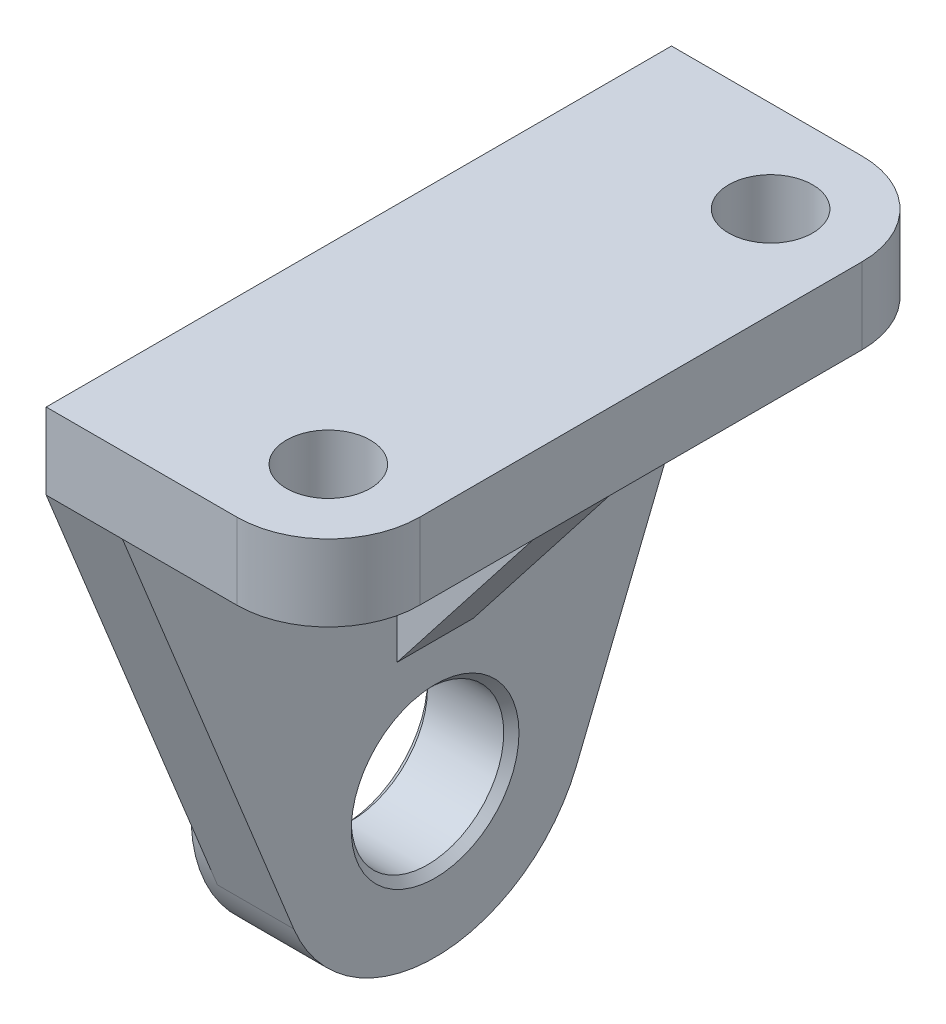
ISO-10303-21;
HEADER;
FILE_DESCRIPTION(('STEP AP214'),'2;1');
FILE_NAME('part.step','',(''),(''),'','','');
FILE_SCHEMA(('AUTOMOTIVE_DESIGN { 1 0 10303 214 1 1 1 1 }'));
ENDSEC;
DATA;
#1=APPLICATION_CONTEXT('core data for automotive mechanical design processes');
#2=APPLICATION_PROTOCOL_DEFINITION('international standard','automotive_design',2000,#1);
#3=PRODUCT_CONTEXT('',#1,'mechanical');
#4=PRODUCT('Part','Part','',(#3));
#5=PRODUCT_RELATED_PRODUCT_CATEGORY('part','',(#4));
#6=PRODUCT_DEFINITION_FORMATION('','',#4);
#7=PRODUCT_DEFINITION_CONTEXT('part definition',#1,'design');
#8=PRODUCT_DEFINITION('design','',#6,#7);
#9=PRODUCT_DEFINITION_SHAPE('','',#8);
#10=(LENGTH_UNIT() NAMED_UNIT(*) SI_UNIT(.MILLI.,.METRE.));
#11=(NAMED_UNIT(*) PLANE_ANGLE_UNIT() SI_UNIT($,.RADIAN.));
#12=(NAMED_UNIT(*) SI_UNIT($,.STERADIAN.) SOLID_ANGLE_UNIT());
#13=UNCERTAINTY_MEASURE_WITH_UNIT(LENGTH_MEASURE(1.E-05),#10,'distance_accuracy_value','');
#14=(GEOMETRIC_REPRESENTATION_CONTEXT(3) GLOBAL_UNCERTAINTY_ASSIGNED_CONTEXT((#13)) GLOBAL_UNIT_ASSIGNED_CONTEXT((#10,
#11,#12)) REPRESENTATION_CONTEXT('',''));
#15=CARTESIAN_POINT('',(0.,0.,0.));
#16=DIRECTION('',(0.,0.,1.));
#17=DIRECTION('',(1.,0.,0.));
#18=AXIS2_PLACEMENT_3D('',#15,#16,#17);
#19=CARTESIAN_POINT('',(-10.,58.,41.0000000000004));
#20=DIRECTION('',(0.,0.,1.00000000000001));
#21=DIRECTION('',(1.00000000000001,0.,0.));
#22=AXIS2_PLACEMENT_3D('',#19,#20,#21);
#23=PLANE('',#22);
#24=DIRECTION('',(-1.00000000000001,0.,0.));
#25=VECTOR('',#24,1.);
#26=CARTESIAN_POINT('',(27.0000000000004,48.,41.0000000000004));
#27=LINE('',#26,#25);
#28=CARTESIAN_POINT('',(15.0000000000004,48.,41.0000000000004));
#29=VERTEX_POINT('',#28);
#30=CARTESIAN_POINT('',(0.,48.,41.0000000000004));
#31=VERTEX_POINT('',#30);
#32=EDGE_CURVE('E178',#29,#31,#27,.T.);
#33=ORIENTED_EDGE('',*,*,#32,.F.);
#34=DIRECTION('',(0.,1.,0.));
#35=VECTOR('',#34,1.);
#36=CARTESIAN_POINT('',(15.0000000000004,58.,41.0000000000004));
#37=LINE('',#36,#35);
#38=CARTESIAN_POINT('',(15.0000000000004,58.,41.0000000000004));
#39=VERTEX_POINT('',#38);
#40=EDGE_CURVE('E244',#29,#39,#37,.T.);
#41=ORIENTED_EDGE('',*,*,#40,.T.);
#42=DIRECTION('',(1.00000000000001,0.,0.));
#43=VECTOR('',#42,1.);
#44=CARTESIAN_POINT('',(-10.,58.,41.0000000000004));
#45=LINE('',#44,#43);
#46=CARTESIAN_POINT('',(-10.,58.,41.0000000000004));
#47=VERTEX_POINT('',#46);
#48=EDGE_CURVE('E211',#47,#39,#45,.T.);
#49=ORIENTED_EDGE('',*,*,#48,.F.);
#50=DIRECTION('',(0.,-1.,0.));
#51=VECTOR('',#50,1.);
#52=CARTESIAN_POINT('',(-10.,58.,41.0000000000004));
#53=LINE('',#52,#51);
#54=CARTESIAN_POINT('',(-10.,48.,41.0000000000004));
#55=VERTEX_POINT('',#54);
#56=EDGE_CURVE('E188',#47,#55,#53,.T.);
#57=ORIENTED_EDGE('',*,*,#56,.T.);
#58=DIRECTION('',(1.00000000000001,0.,0.));
#59=VECTOR('',#58,1.);
#60=CARTESIAN_POINT('',(-10.,48.,41.0000000000004));
#61=LINE('',#60,#59);
#62=EDGE_CURVE('E203',#55,#31,#61,.T.);
#63=ORIENTED_EDGE('',*,*,#62,.T.);
#64=EDGE_LOOP('',(#33,#41,#49,#57,#63));
#65=FACE_BOUND('',#64,.T.);
#66=ADVANCED_FACE('F32',(#65),#23,.T.);
#67=CARTESIAN_POINT('',(-10.,58.,41.0000000000004));
#68=DIRECTION('',(0.,1.,0.));
#69=DIRECTION('',(0.,0.,1.00000000000001));
#70=AXIS2_PLACEMENT_3D('',#67,#68,#69);
#71=PLANE('',#70);
#72=DIRECTION('',(0.,0.,-1.00000000000001));
#73=VECTOR('',#72,1.);
#74=CARTESIAN_POINT('',(27.0000000000004,58.,-41.0000000000004));
#75=LINE('',#74,#73);
#76=CARTESIAN_POINT('',(27.0000000000004,58.,29.0000000000004));
#77=VERTEX_POINT('',#76);
#78=CARTESIAN_POINT('',(27.0000000000004,58.,-29.0000000000004));
#79=VERTEX_POINT('',#78);
#80=EDGE_CURVE('E175',#77,#79,#75,.T.);
#81=ORIENTED_EDGE('',*,*,#80,.T.);
#82=CARTESIAN_POINT('',(15.0000000000004,58.,-29.0000000000004));
#83=DIRECTION('',(0.,1.,0.));
#84=DIRECTION('',(0.,0.,1.00000000000001));
#85=AXIS2_PLACEMENT_3D('',#82,#83,#84);
#86=CIRCLE('',#85,12.);
#87=CARTESIAN_POINT('',(15.0000000000004,58.,-41.0000000000004));
#88=VERTEX_POINT('',#87);
#89=EDGE_CURVE('E242',#79,#88,#86,.T.);
#90=ORIENTED_EDGE('',*,*,#89,.T.);
#91=DIRECTION('',(1.00000000000001,0.,0.));
#92=VECTOR('',#91,1.);
#93=CARTESIAN_POINT('',(-10.,58.,-41.0000000000004));
#94=LINE('',#93,#92);
#95=CARTESIAN_POINT('',(-10.,58.,-41.0000000000004));
#96=VERTEX_POINT('',#95);
#97=EDGE_CURVE('E215',#96,#88,#94,.T.);
#98=ORIENTED_EDGE('',*,*,#97,.F.);
#99=DIRECTION('',(0.,0.,1.00000000000001));
#100=VECTOR('',#99,1.);
#101=CARTESIAN_POINT('',(-10.,58.,41.0000000000004));
#102=LINE('',#101,#100);
#103=EDGE_CURVE('E201',#96,#47,#102,.T.);
#104=ORIENTED_EDGE('',*,*,#103,.T.);
#105=ORIENTED_EDGE('',*,*,#48,.T.);
#106=CARTESIAN_POINT('',(15.0000000000004,58.,29.0000000000004));
#107=DIRECTION('',(0.,1.,0.));
#108=DIRECTION('',(0.,0.,1.00000000000001));
#109=AXIS2_PLACEMENT_3D('',#106,#107,#108);
#110=CIRCLE('',#109,12.);
#111=EDGE_CURVE('E55',#39,#77,#110,.T.);
#112=ORIENTED_EDGE('',*,*,#111,.T.);
#113=EDGE_LOOP('',(#81,#90,#98,#104,#105,#112));
#114=FACE_BOUND('',#113,.T.);
#115=CARTESIAN_POINT('',(15.0000000000004,58.,29.0000000000004));
#116=DIRECTION('',(0.,-1.,0.));
#117=DIRECTION('',(0.,0.,-1.00000000000001));
#118=AXIS2_PLACEMENT_3D('',#115,#116,#117);
#119=CIRCLE('',#118,5.5);
#120=CARTESIAN_POINT('',(15.0000000000004,58.,23.5000000000003));
#121=VERTEX_POINT('',#120);
#122=EDGE_CURVE('E144',#121,#121,#119,.T.);
#123=ORIENTED_EDGE('',*,*,#122,.T.);
#124=EDGE_LOOP('',(#123));
#125=FACE_BOUND('',#124,.T.);
#126=CARTESIAN_POINT('',(15.0000000000004,58.,-29.0000000000004));
#127=DIRECTION('',(0.,-1.,0.));
#128=DIRECTION('',(0.,0.,-1.00000000000001));
#129=AXIS2_PLACEMENT_3D('',#126,#127,#128);
#130=CIRCLE('',#129,5.5);
#131=CARTESIAN_POINT('',(15.0000000000004,58.,-34.5000000000005));
#132=VERTEX_POINT('',#131);
#133=EDGE_CURVE('E160',#132,#132,#130,.T.);
#134=ORIENTED_EDGE('',*,*,#133,.T.);
#135=EDGE_LOOP('',(#134));
#136=FACE_BOUND('',#135,.T.);
#137=ADVANCED_FACE('F275',(#114,#125,#136),#71,.T.);
#138=CARTESIAN_POINT('',(-10.,58.,-41.0000000000004));
#139=DIRECTION('',(0.,0.,-1.00000000000001));
#140=DIRECTION('',(-1.00000000000001,0.,0.));
#141=AXIS2_PLACEMENT_3D('',#138,#139,#140);
#142=PLANE('',#141);
#143=ORIENTED_EDGE('',*,*,#97,.T.);
#144=DIRECTION('',(0.,-1.,0.));
#145=VECTOR('',#144,1.);
#146=CARTESIAN_POINT('',(15.0000000000004,48.,-41.0000000000004));
#147=LINE('',#146,#145);
#148=CARTESIAN_POINT('',(15.0000000000004,48.,-41.0000000000004));
#149=VERTEX_POINT('',#148);
#150=EDGE_CURVE('E229',#88,#149,#147,.T.);
#151=ORIENTED_EDGE('',*,*,#150,.T.);
#152=DIRECTION('',(-1.00000000000001,0.,0.));
#153=VECTOR('',#152,1.);
#154=CARTESIAN_POINT('',(27.0000000000004,48.,-41.0000000000004));
#155=LINE('',#154,#153);
#156=CARTESIAN_POINT('',(0.,48.,-41.0000000000004));
#157=VERTEX_POINT('',#156);
#158=EDGE_CURVE('E177',#149,#157,#155,.T.);
#159=ORIENTED_EDGE('',*,*,#158,.T.);
#160=DIRECTION('',(1.00000000000001,0.,0.));
#161=VECTOR('',#160,1.);
#162=CARTESIAN_POINT('',(-10.,48.,-41.0000000000004));
#163=LINE('',#162,#161);
#164=CARTESIAN_POINT('',(-10.,48.,-41.0000000000004));
#165=VERTEX_POINT('',#164);
#166=EDGE_CURVE('E218',#165,#157,#163,.T.);
#167=ORIENTED_EDGE('',*,*,#166,.F.);
#168=DIRECTION('',(0.,1.,0.));
#169=VECTOR('',#168,1.);
#170=CARTESIAN_POINT('',(-10.,58.,-41.0000000000004));
#171=LINE('',#170,#169);
#172=EDGE_CURVE('E198',#165,#96,#171,.T.);
#173=ORIENTED_EDGE('',*,*,#172,.T.);
#174=EDGE_LOOP('',(#143,#151,#159,#167,#173));
#175=FACE_BOUND('',#174,.T.);
#176=ADVANCED_FACE('F281',(#175),#142,.T.);
#177=CARTESIAN_POINT('',(-10.,48.,-41.0000000000004));
#178=DIRECTION('',(0.,-0.375124128057045,-0.926974588944846));
#179=DIRECTION('',(0.,0.926974588944833,-0.375124128057052));
#180=AXIS2_PLACEMENT_3D('',#177,#178,#179);
#181=PLANE('',#180);
#182=DIRECTION('',(0.,0.926974588944833,-0.375124128057052));
#183=VECTOR('',#182,1.);
#184=CARTESIAN_POINT('',(0.,48.,-41.0000000000004));
#185=LINE('',#184,#183);
#186=CARTESIAN_POINT('',(0.,-7.50248256114089,-18.5394917788969));
#187=VERTEX_POINT('',#186);
#188=EDGE_CURVE('E192',#187,#157,#185,.T.);
#189=ORIENTED_EDGE('',*,*,#188,.F.);
#190=DIRECTION('',(1.00000000000001,0.,0.));
#191=VECTOR('',#190,1.);
#192=CARTESIAN_POINT('',(-10.,-7.50248256114089,-18.5394917788969));
#193=LINE('',#192,#191);
#194=CARTESIAN_POINT('',(-10.,-7.5024825611409,-18.5394917788969));
#195=VERTEX_POINT('',#194);
#196=EDGE_CURVE('E221',#195,#187,#193,.T.);
#197=ORIENTED_EDGE('',*,*,#196,.F.);
#198=DIRECTION('',(0.,0.926974588944833,-0.375124128057052));
#199=VECTOR('',#198,1.);
#200=CARTESIAN_POINT('',(-10.,48.,-41.0000000000004));
#201=LINE('',#200,#199);
#202=EDGE_CURVE('E195',#195,#165,#201,.T.);
#203=ORIENTED_EDGE('',*,*,#202,.T.);
#204=ORIENTED_EDGE('',*,*,#166,.T.);
#205=EDGE_LOOP('',(#189,#197,#203,#204));
#206=FACE_BOUND('',#205,.T.);
#207=ADVANCED_FACE('F339',(#206),#181,.T.);
#208=CARTESIAN_POINT('',(-10.,0.,0.));
#209=DIRECTION('',(1.00000000000001,0.,0.));
#210=DIRECTION('',(0.,0.,-1.00000000000001));
#211=AXIS2_PLACEMENT_3D('',#208,#209,#210);
#212=CYLINDRICAL_SURFACE('',#211,20.);
#213=DIRECTION('',(1.00000000000001,0.,0.));
#214=VECTOR('',#213,1.);
#215=CARTESIAN_POINT('',(-10.,-7.50248256114089,18.5394917788969));
#216=LINE('',#215,#214);
#217=CARTESIAN_POINT('',(-10.,-7.50248256114089,18.5394917788969));
#218=VERTEX_POINT('',#217);
#219=CARTESIAN_POINT('',(0.,-7.50248256114089,18.5394917788969));
#220=VERTEX_POINT('',#219);
#221=EDGE_CURVE('E223',#218,#220,#216,.T.);
#222=ORIENTED_EDGE('',*,*,#221,.F.);
#223=CARTESIAN_POINT('',(-10.,0.,0.));
#224=DIRECTION('',(1.00000000000001,0.,0.));
#225=DIRECTION('',(0.,0.,-1.00000000000001));
#226=AXIS2_PLACEMENT_3D('',#223,#224,#225);
#227=CIRCLE('',#226,20.);
#228=EDGE_CURVE('E185',#195,#218,#227,.T.);
#229=ORIENTED_EDGE('',*,*,#228,.F.);
#230=ORIENTED_EDGE('',*,*,#196,.T.);
#231=CARTESIAN_POINT('',(0.,0.,0.));
#232=DIRECTION('',(1.00000000000001,0.,0.));
#233=DIRECTION('',(0.,0.,-1.00000000000001));
#234=AXIS2_PLACEMENT_3D('',#231,#232,#233);
#235=CIRCLE('',#234,20.);
#236=EDGE_CURVE('E206',#220,#187,#235,.T.);
#237=ORIENTED_EDGE('',*,*,#236,.F.);
#238=EDGE_LOOP('',(#222,#229,#230,#237));
#239=FACE_BOUND('',#238,.T.);
#240=CARTESIAN_POINT('',(-12.0000000000001,0.,0.));
#241=DIRECTION('',(1.00000000000001,0.,0.));
#242=DIRECTION('',(0.,0.,-1.00000000000001));
#243=AXIS2_PLACEMENT_3D('',#240,#241,#242);
#244=CIRCLE('',#243,20.);
#245=CARTESIAN_POINT('',(-12.0000000000001,0.,-20.0000000000003));
#246=VERTEX_POINT('',#245);
#247=EDGE_CURVE('E180',#246,#246,#244,.T.);
#248=ORIENTED_EDGE('',*,*,#247,.T.);
#249=EDGE_LOOP('',(#248));
#250=FACE_BOUND('',#249,.T.);
#251=ADVANCED_FACE('F336',(#239,#250),#212,.T.);
#252=CARTESIAN_POINT('',(-10.,48.,41.0000000000004));
#253=DIRECTION('',(0.,-0.375124128057045,0.926974588944846));
#254=DIRECTION('',(0.,-0.926974588944833,-0.375124128057052));
#255=AXIS2_PLACEMENT_3D('',#252,#253,#254);
#256=PLANE('',#255);
#257=DIRECTION('',(0.,-0.926974588944833,-0.375124128057052));
#258=VECTOR('',#257,1.);
#259=CARTESIAN_POINT('',(0.,48.,41.0000000000004));
#260=LINE('',#259,#258);
#261=EDGE_CURVE('E187',#31,#220,#260,.T.);
#262=ORIENTED_EDGE('',*,*,#261,.F.);
#263=ORIENTED_EDGE('',*,*,#62,.F.);
#264=DIRECTION('',(0.,-0.926974588944833,-0.375124128057052));
#265=VECTOR('',#264,1.);
#266=CARTESIAN_POINT('',(-10.,48.,41.0000000000004));
#267=LINE('',#266,#265);
#268=EDGE_CURVE('E191',#55,#218,#267,.T.);
#269=ORIENTED_EDGE('',*,*,#268,.T.);
#270=ORIENTED_EDGE('',*,*,#221,.T.);
#271=EDGE_LOOP('',(#262,#263,#269,#270));
#272=FACE_BOUND('',#271,.T.);
#273=ADVANCED_FACE('F287',(#272),#256,.T.);
#274=CARTESIAN_POINT('',(-10.,0.,0.));
#275=DIRECTION('',(1.00000000000001,0.,0.));
#276=DIRECTION('',(0.,0.,-1.00000000000001));
#277=AXIS2_PLACEMENT_3D('',#274,#275,#276);
#278=PLANE('',#277);
#279=ORIENTED_EDGE('',*,*,#56,.F.);
#280=ORIENTED_EDGE('',*,*,#103,.F.);
#281=ORIENTED_EDGE('',*,*,#172,.F.);
#282=ORIENTED_EDGE('',*,*,#202,.F.);
#283=ORIENTED_EDGE('',*,*,#228,.T.);
#284=ORIENTED_EDGE('',*,*,#268,.F.);
#285=EDGE_LOOP('',(#279,#280,#281,#282,#283,#284));
#286=FACE_BOUND('',#285,.T.);
#287=ADVANCED_FACE('F332',(#286),#278,.F.);
#288=CARTESIAN_POINT('',(0.,0.,0.));
#289=DIRECTION('',(1.00000000000001,0.,0.));
#290=DIRECTION('',(0.,0.,-1.00000000000001));
#291=AXIS2_PLACEMENT_3D('',#288,#289,#290);
#292=PLANE('',#291);
#293=CARTESIAN_POINT('',(0.,0.,0.));
#294=DIRECTION('',(1.00000000000001,0.,0.));
#295=DIRECTION('',(0.,0.,-1.00000000000001));
#296=AXIS2_PLACEMENT_3D('',#293,#294,#295);
#297=CIRCLE('',#296,11.);
#298=CARTESIAN_POINT('',(0.,0.,-11.0000000000002));
#299=VERTEX_POINT('',#298);
#300=EDGE_CURVE('E11',#299,#299,#297,.F.);
#301=ORIENTED_EDGE('',*,*,#300,.T.);
#302=EDGE_LOOP('',(#301));
#303=FACE_BOUND('',#302,.T.);
#304=DIRECTION('',(0.,-1.,0.));
#305=VECTOR('',#304,1.);
#306=CARTESIAN_POINT('',(0.,0.,5.00000000000005));
#307=LINE('',#306,#305);
#308=CARTESIAN_POINT('',(0.,48.,5.00000000000005));
#309=VERTEX_POINT('',#308);
#310=CARTESIAN_POINT('',(0.,16.,5.00000000000005));
#311=VERTEX_POINT('',#310);
#312=EDGE_CURVE('E142',#309,#311,#307,.T.);
#313=ORIENTED_EDGE('',*,*,#312,.F.);
#314=DIRECTION('',(0.,0.,-1.00000000000001));
#315=VECTOR('',#314,1.);
#316=CARTESIAN_POINT('',(0.,48.,0.));
#317=LINE('',#316,#315);
#318=EDGE_CURVE('E227',#31,#309,#317,.T.);
#319=ORIENTED_EDGE('',*,*,#318,.F.);
#320=ORIENTED_EDGE('',*,*,#261,.T.);
#321=ORIENTED_EDGE('',*,*,#236,.T.);
#322=ORIENTED_EDGE('',*,*,#188,.T.);
#323=CARTESIAN_POINT('',(0.,48.,-5.00000000000005));
#324=VERTEX_POINT('',#323);
#325=EDGE_CURVE('E214',#324,#157,#317,.T.);
#326=ORIENTED_EDGE('',*,*,#325,.F.);
#327=DIRECTION('',(0.,-1.,0.));
#328=VECTOR('',#327,1.);
#329=CARTESIAN_POINT('',(0.,0.,-5.00000000000005));
#330=LINE('',#329,#328);
#331=CARTESIAN_POINT('',(0.,16.,-5.00000000000005));
#332=VERTEX_POINT('',#331);
#333=EDGE_CURVE('E47',#324,#332,#330,.T.);
#334=ORIENTED_EDGE('',*,*,#333,.T.);
#335=DIRECTION('',(0.,0.,1.00000000000001));
#336=VECTOR('',#335,1.);
#337=CARTESIAN_POINT('',(0.,16.,0.));
#338=LINE('',#337,#336);
#339=EDGE_CURVE('E135',#311,#332,#338,.F.);
#340=ORIENTED_EDGE('',*,*,#339,.F.);
#341=EDGE_LOOP('',(#313,#319,#320,#321,#322,#326,#334,#340));
#342=FACE_BOUND('',#341,.T.);
#343=ADVANCED_FACE('F315',(#303,#342),#292,.T.);
#344=CARTESIAN_POINT('',(-12.0000000000001,0.,0.));
#345=DIRECTION('',(1.00000000000001,0.,0.));
#346=DIRECTION('',(0.,0.,-1.00000000000001));
#347=AXIS2_PLACEMENT_3D('',#344,#345,#346);
#348=PLANE('',#347);
#349=CARTESIAN_POINT('',(-12.0000000000001,0.,0.));
#350=DIRECTION('',(1.00000000000001,0.,0.));
#351=DIRECTION('',(0.,0.,-1.00000000000001));
#352=AXIS2_PLACEMENT_3D('',#349,#350,#351);
#353=CIRCLE('',#352,11.);
#354=CARTESIAN_POINT('',(-12.0000000000001,0.,-11.0000000000001));
#355=VERTEX_POINT('',#354);
#356=EDGE_CURVE('E40',#355,#355,#353,.T.);
#357=ORIENTED_EDGE('',*,*,#356,.T.);
#358=EDGE_LOOP('',(#357));
#359=FACE_BOUND('',#358,.T.);
#360=ORIENTED_EDGE('',*,*,#247,.F.);
#361=EDGE_LOOP('',(#360));
#362=FACE_BOUND('',#361,.T.);
#363=ADVANCED_FACE('F254',(#359,#362),#348,.F.);
#364=CARTESIAN_POINT('',(27.0000000000004,48.,-41.0000000000004));
#365=DIRECTION('',(0.,-1.,0.));
#366=DIRECTION('',(0.,0.,-1.00000000000001));
#367=AXIS2_PLACEMENT_3D('',#364,#365,#366);
#368=PLANE('',#367);
#369=DIRECTION('',(-1.00000000000001,0.,0.));
#370=VECTOR('',#369,1.);
#371=CARTESIAN_POINT('',(27.0000000000004,48.,5.00000000000005));
#372=LINE('',#371,#370);
#373=CARTESIAN_POINT('',(25.0000000000004,48.,5.00000000000005));
#374=VERTEX_POINT('',#373);
#375=EDGE_CURVE('E141',#374,#309,#372,.T.);
#376=ORIENTED_EDGE('',*,*,#375,.F.);
#377=DIRECTION('',(0.,0.,-1.00000000000001));
#378=VECTOR('',#377,1.);
#379=CARTESIAN_POINT('',(25.0000000000004,48.,-41.0000000000004));
#380=LINE('',#379,#378);
#381=CARTESIAN_POINT('',(25.0000000000004,48.,-5.00000000000005));
#382=VERTEX_POINT('',#381);
#383=EDGE_CURVE('E132',#382,#374,#380,.F.);
#384=ORIENTED_EDGE('',*,*,#383,.F.);
#385=DIRECTION('',(-1.00000000000001,0.,0.));
#386=VECTOR('',#385,1.);
#387=CARTESIAN_POINT('',(27.0000000000004,48.,-5.00000000000005));
#388=LINE('',#387,#386);
#389=EDGE_CURVE('E120',#382,#324,#388,.T.);
#390=ORIENTED_EDGE('',*,*,#389,.T.);
#391=ORIENTED_EDGE('',*,*,#325,.T.);
#392=ORIENTED_EDGE('',*,*,#158,.F.);
#393=CARTESIAN_POINT('',(15.0000000000004,48.,-29.0000000000004));
#394=DIRECTION('',(0.,-1.,0.));
#395=DIRECTION('',(0.,0.,-1.00000000000001));
#396=AXIS2_PLACEMENT_3D('',#393,#394,#395);
#397=CIRCLE('',#396,12.);
#398=CARTESIAN_POINT('',(27.0000000000004,48.,-29.0000000000004));
#399=VERTEX_POINT('',#398);
#400=EDGE_CURVE('E234',#149,#399,#397,.T.);
#401=ORIENTED_EDGE('',*,*,#400,.T.);
#402=DIRECTION('',(0.,0.,1.00000000000001));
#403=VECTOR('',#402,1.);
#404=CARTESIAN_POINT('',(27.0000000000004,48.,-41.0000000000004));
#405=LINE('',#404,#403);
#406=CARTESIAN_POINT('',(27.0000000000004,48.,29.0000000000004));
#407=VERTEX_POINT('',#406);
#408=EDGE_CURVE('E172',#399,#407,#405,.T.);
#409=ORIENTED_EDGE('',*,*,#408,.T.);
#410=CARTESIAN_POINT('',(15.0000000000004,48.,29.0000000000004));
#411=DIRECTION('',(0.,-1.,0.));
#412=DIRECTION('',(0.,0.,-1.00000000000001));
#413=AXIS2_PLACEMENT_3D('',#410,#411,#412);
#414=CIRCLE('',#413,12.);
#415=EDGE_CURVE('E232',#407,#29,#414,.T.);
#416=ORIENTED_EDGE('',*,*,#415,.T.);
#417=ORIENTED_EDGE('',*,*,#32,.T.);
#418=ORIENTED_EDGE('',*,*,#318,.T.);
#419=EDGE_LOOP('',(#376,#384,#390,#391,#392,#401,#409,#416,#417,#418));
#420=FACE_BOUND('',#419,.T.);
#421=CARTESIAN_POINT('',(15.0000000000004,48.,29.0000000000004));
#422=DIRECTION('',(0.,-1.,0.));
#423=DIRECTION('',(0.,0.,-1.00000000000001));
#424=AXIS2_PLACEMENT_3D('',#421,#422,#423);
#425=CIRCLE('',#424,11.);
#426=CARTESIAN_POINT('',(15.0000000000004,48.,18.0000000000003));
#427=VERTEX_POINT('',#426);
#428=EDGE_CURVE('E157',#427,#427,#425,.T.);
#429=ORIENTED_EDGE('',*,*,#428,.F.);
#430=EDGE_LOOP('',(#429));
#431=FACE_BOUND('',#430,.T.);
#432=CARTESIAN_POINT('',(15.0000000000004,48.,-29.0000000000004));
#433=DIRECTION('',(0.,-1.,0.));
#434=DIRECTION('',(0.,0.,-1.00000000000001));
#435=AXIS2_PLACEMENT_3D('',#432,#433,#434);
#436=CIRCLE('',#435,11.);
#437=CARTESIAN_POINT('',(15.0000000000004,48.,-40.0000000000006));
#438=VERTEX_POINT('',#437);
#439=EDGE_CURVE('E169',#438,#438,#436,.T.);
#440=ORIENTED_EDGE('',*,*,#439,.F.);
#441=EDGE_LOOP('',(#440));
#442=FACE_BOUND('',#441,.T.);
#443=ADVANCED_FACE('F138',(#420,#431,#442),#368,.T.);
#444=CARTESIAN_POINT('',(27.0000000000004,48.,-41.0000000000004));
#445=DIRECTION('',(-1.00000000000001,0.,0.));
#446=DIRECTION('',(0.,0.,1.00000000000001));
#447=AXIS2_PLACEMENT_3D('',#444,#445,#446);
#448=PLANE('',#447);
#449=DIRECTION('',(0.,-1.,0.));
#450=VECTOR('',#449,1.);
#451=CARTESIAN_POINT('',(27.0000000000004,58.,-29.0000000000004));
#452=LINE('',#451,#450);
#453=EDGE_CURVE('E238',#399,#79,#452,.F.);
#454=ORIENTED_EDGE('',*,*,#453,.T.);
#455=ORIENTED_EDGE('',*,*,#80,.F.);
#456=DIRECTION('',(0.,1.,0.));
#457=VECTOR('',#456,1.);
#458=CARTESIAN_POINT('',(27.0000000000004,48.,29.0000000000004));
#459=LINE('',#458,#457);
#460=EDGE_CURVE('E236',#77,#407,#459,.F.);
#461=ORIENTED_EDGE('',*,*,#460,.T.);
#462=ORIENTED_EDGE('',*,*,#408,.F.);
#463=EDGE_LOOP('',(#454,#455,#461,#462));
#464=FACE_BOUND('',#463,.T.);
#465=ADVANCED_FACE('F293',(#464),#448,.F.);
#466=CARTESIAN_POINT('',(15.0000000000004,58.,-29.0000000000004));
#467=DIRECTION('',(0.,1.,0.));
#468=DIRECTION('',(0.,0.,1.00000000000001));
#469=AXIS2_PLACEMENT_3D('',#466,#467,#468);
#470=CYLINDRICAL_SURFACE('',#469,12.);
#471=ORIENTED_EDGE('',*,*,#89,.F.);
#472=ORIENTED_EDGE('',*,*,#453,.F.);
#473=ORIENTED_EDGE('',*,*,#400,.F.);
#474=ORIENTED_EDGE('',*,*,#150,.F.);
#475=EDGE_LOOP('',(#471,#472,#473,#474));
#476=FACE_BOUND('',#475,.T.);
#477=ADVANCED_FACE('F289',(#476),#470,.T.);
#478=CARTESIAN_POINT('',(15.0000000000004,58.,29.0000000000004));
#479=DIRECTION('',(0.,-1.,0.));
#480=DIRECTION('',(0.,0.,-1.00000000000001));
#481=AXIS2_PLACEMENT_3D('',#478,#479,#480);
#482=CYLINDRICAL_SURFACE('',#481,12.);
#483=ORIENTED_EDGE('',*,*,#415,.F.);
#484=ORIENTED_EDGE('',*,*,#460,.F.);
#485=ORIENTED_EDGE('',*,*,#111,.F.);
#486=ORIENTED_EDGE('',*,*,#40,.F.);
#487=EDGE_LOOP('',(#483,#484,#485,#486));
#488=FACE_BOUND('',#487,.T.);
#489=ADVANCED_FACE('F292',(#488),#482,.T.);
#490=CARTESIAN_POINT('',(15.0000000000004,48.,-29.0000000000004));
#491=DIRECTION('',(0.,-1.,0.));
#492=DIRECTION('',(0.,0.,-1.00000000000001));
#493=AXIS2_PLACEMENT_3D('',#490,#491,#492);
#494=CYLINDRICAL_SURFACE('',#493,11.);
#495=CARTESIAN_POINT('',(15.0000000000004,49.,-29.0000000000004));
#496=DIRECTION('',(0.,-1.,0.));
#497=DIRECTION('',(0.,0.,-1.00000000000001));
#498=AXIS2_PLACEMENT_3D('',#495,#496,#497);
#499=CIRCLE('',#498,11.);
#500=CARTESIAN_POINT('',(15.0000000000004,49.,-40.0000000000006));
#501=VERTEX_POINT('',#500);
#502=EDGE_CURVE('E166',#501,#501,#499,.T.);
#503=ORIENTED_EDGE('',*,*,#502,.F.);
#504=EDGE_LOOP('',(#503));
#505=FACE_BOUND('',#504,.T.);
#506=ORIENTED_EDGE('',*,*,#439,.T.);
#507=EDGE_LOOP('',(#506));
#508=FACE_BOUND('',#507,.T.);
#509=ADVANCED_FACE('F296',(#505,#508),#494,.F.);
#510=CARTESIAN_POINT('',(20.5000000000004,49.,-29.0000000000004));
#511=DIRECTION('',(0.,1.,0.));
#512=DIRECTION('',(0.,0.,1.00000000000001));
#513=AXIS2_PLACEMENT_3D('',#510,#511,#512);
#514=PLANE('',#513);
#515=CARTESIAN_POINT('',(15.0000000000004,49.,-29.0000000000004));
#516=DIRECTION('',(0.,-1.,0.));
#517=DIRECTION('',(0.,0.,-1.00000000000001));
#518=AXIS2_PLACEMENT_3D('',#515,#516,#517);
#519=CIRCLE('',#518,5.5);
#520=CARTESIAN_POINT('',(15.0000000000004,49.,-34.5000000000005));
#521=VERTEX_POINT('',#520);
#522=EDGE_CURVE('E163',#521,#521,#519,.T.);
#523=ORIENTED_EDGE('',*,*,#522,.F.);
#524=EDGE_LOOP('',(#523));
#525=FACE_BOUND('',#524,.T.);
#526=ORIENTED_EDGE('',*,*,#502,.T.);
#527=EDGE_LOOP('',(#526));
#528=FACE_BOUND('',#527,.T.);
#529=ADVANCED_FACE('F300',(#525,#528),#514,.F.);
#530=CARTESIAN_POINT('',(15.0000000000004,48.,-29.0000000000004));
#531=DIRECTION('',(0.,-1.,0.));
#532=DIRECTION('',(0.,0.,-1.00000000000001));
#533=AXIS2_PLACEMENT_3D('',#530,#531,#532);
#534=CYLINDRICAL_SURFACE('',#533,5.5);
#535=ORIENTED_EDGE('',*,*,#133,.F.);
#536=EDGE_LOOP('',(#535));
#537=FACE_BOUND('',#536,.T.);
#538=ORIENTED_EDGE('',*,*,#522,.T.);
#539=EDGE_LOOP('',(#538));
#540=FACE_BOUND('',#539,.T.);
#541=ADVANCED_FACE('F361',(#537,#540),#534,.F.);
#542=CARTESIAN_POINT('',(15.0000000000004,48.,29.0000000000004));
#543=DIRECTION('',(0.,-1.,0.));
#544=DIRECTION('',(0.,0.,-1.00000000000001));
#545=AXIS2_PLACEMENT_3D('',#542,#543,#544);
#546=CYLINDRICAL_SURFACE('',#545,11.);
#547=CARTESIAN_POINT('',(15.0000000000004,49.,29.0000000000004));
#548=DIRECTION('',(0.,-1.,0.));
#549=DIRECTION('',(0.,0.,-1.00000000000001));
#550=AXIS2_PLACEMENT_3D('',#547,#548,#549);
#551=CIRCLE('',#550,11.);
#552=CARTESIAN_POINT('',(15.0000000000004,49.,18.0000000000003));
#553=VERTEX_POINT('',#552);
#554=EDGE_CURVE('E154',#553,#553,#551,.T.);
#555=ORIENTED_EDGE('',*,*,#554,.F.);
#556=EDGE_LOOP('',(#555));
#557=FACE_BOUND('',#556,.T.);
#558=ORIENTED_EDGE('',*,*,#428,.T.);
#559=EDGE_LOOP('',(#558));
#560=FACE_BOUND('',#559,.T.);
#561=ADVANCED_FACE('F365',(#557,#560),#546,.F.);
#562=CARTESIAN_POINT('',(20.5000000000004,49.,29.0000000000004));
#563=DIRECTION('',(0.,1.,0.));
#564=DIRECTION('',(0.,0.,1.00000000000001));
#565=AXIS2_PLACEMENT_3D('',#562,#563,#564);
#566=PLANE('',#565);
#567=CARTESIAN_POINT('',(15.0000000000004,49.,29.0000000000004));
#568=DIRECTION('',(0.,-1.,0.));
#569=DIRECTION('',(0.,0.,-1.00000000000001));
#570=AXIS2_PLACEMENT_3D('',#567,#568,#569);
#571=CIRCLE('',#570,5.5);
#572=CARTESIAN_POINT('',(15.0000000000004,49.,23.5000000000003));
#573=VERTEX_POINT('',#572);
#574=EDGE_CURVE('E151',#573,#573,#571,.T.);
#575=ORIENTED_EDGE('',*,*,#574,.F.);
#576=EDGE_LOOP('',(#575));
#577=FACE_BOUND('',#576,.T.);
#578=ORIENTED_EDGE('',*,*,#554,.T.);
#579=EDGE_LOOP('',(#578));
#580=FACE_BOUND('',#579,.T.);
#581=ADVANCED_FACE('F369',(#577,#580),#566,.F.);
#582=CARTESIAN_POINT('',(15.0000000000004,48.,29.0000000000004));
#583=DIRECTION('',(0.,-1.,0.));
#584=DIRECTION('',(0.,0.,-1.00000000000001));
#585=AXIS2_PLACEMENT_3D('',#582,#583,#584);
#586=CYLINDRICAL_SURFACE('',#585,5.5);
#587=ORIENTED_EDGE('',*,*,#122,.F.);
#588=EDGE_LOOP('',(#587));
#589=FACE_BOUND('',#588,.T.);
#590=ORIENTED_EDGE('',*,*,#574,.T.);
#591=EDGE_LOOP('',(#590));
#592=FACE_BOUND('',#591,.T.);
#593=ADVANCED_FACE('F265',(#589,#592),#586,.F.);
#594=CARTESIAN_POINT('',(-12.0000000000001,0.,0.));
#595=DIRECTION('',(-1.00000000000001,0.,0.));
#596=DIRECTION('',(0.,0.,1.00000000000001));
#597=AXIS2_PLACEMENT_3D('',#594,#595,#596);
#598=CYLINDRICAL_SURFACE('',#597,9.99999999999999);
#599=CARTESIAN_POINT('',(-11.,0.,0.));
#600=DIRECTION('',(1.00000000000001,0.,0.));
#601=DIRECTION('',(0.,0.,-1.00000000000001));
#602=AXIS2_PLACEMENT_3D('',#599,#600,#601);
#603=CIRCLE('',#602,9.99999999999999);
#604=CARTESIAN_POINT('',(-11.,0.,-10.0000000000001));
#605=VERTEX_POINT('',#604);
#606=EDGE_CURVE('E249',#605,#605,#603,.F.);
#607=ORIENTED_EDGE('',*,*,#606,.T.);
#608=EDGE_LOOP('',(#607));
#609=FACE_BOUND('',#608,.T.);
#610=CARTESIAN_POINT('',(-1.00000000000002,0.,0.));
#611=DIRECTION('',(1.00000000000001,0.,0.));
#612=DIRECTION('',(0.,0.,-1.00000000000001));
#613=AXIS2_PLACEMENT_3D('',#610,#611,#612);
#614=CIRCLE('',#613,9.99999999999999);
#615=CARTESIAN_POINT('',(-1.00000000000002,0.,-10.0000000000001));
#616=VERTEX_POINT('',#615);
#617=EDGE_CURVE('E246',#616,#616,#614,.T.);
#618=ORIENTED_EDGE('',*,*,#617,.T.);
#619=EDGE_LOOP('',(#618));
#620=FACE_BOUND('',#619,.T.);
#621=ADVANCED_FACE('F262',(#609,#620),#598,.F.);
#622=CARTESIAN_POINT('',(25.0000000000004,48.,0.));
#623=DIRECTION('',(-0.788024373724577,0.615644041972315,0.));
#624=DIRECTION('',(-0.615644041972322,-0.788024373724563,0.));
#625=AXIS2_PLACEMENT_3D('',#622,#623,#624);
#626=PLANE('',#625);
#627=DIRECTION('',(-0.615644041972322,-0.788024373724563,0.));
#628=VECTOR('',#627,1.);
#629=CARTESIAN_POINT('',(25.0000000000004,48.,5.00000000000005));
#630=LINE('',#629,#628);
#631=EDGE_CURVE('E127',#374,#311,#630,.T.);
#632=ORIENTED_EDGE('',*,*,#631,.T.);
#633=ORIENTED_EDGE('',*,*,#339,.T.);
#634=DIRECTION('',(-0.615644041972322,-0.788024373724563,0.));
#635=VECTOR('',#634,1.);
#636=CARTESIAN_POINT('',(25.0000000000004,48.,-5.00000000000005));
#637=LINE('',#636,#635);
#638=EDGE_CURVE('E123',#382,#332,#637,.T.);
#639=ORIENTED_EDGE('',*,*,#638,.F.);
#640=ORIENTED_EDGE('',*,*,#383,.T.);
#641=EDGE_LOOP('',(#632,#633,#639,#640));
#642=FACE_BOUND('',#641,.T.);
#643=ADVANCED_FACE('F131',(#642),#626,.F.);
#644=CARTESIAN_POINT('',(7.50000000000021,19.,5.00000000000005));
#645=DIRECTION('',(0.,0.,1.00000000000001));
#646=DIRECTION('',(1.00000000000001,0.,0.));
#647=AXIS2_PLACEMENT_3D('',#644,#645,#646);
#648=PLANE('',#647);
#649=ORIENTED_EDGE('',*,*,#375,.T.);
#650=ORIENTED_EDGE('',*,*,#312,.T.);
#651=ORIENTED_EDGE('',*,*,#631,.F.);
#652=EDGE_LOOP('',(#649,#650,#651));
#653=FACE_BOUND('',#652,.T.);
#654=ADVANCED_FACE('F317',(#653),#648,.T.);
#655=CARTESIAN_POINT('',(7.50000000000021,19.,-5.00000000000005));
#656=DIRECTION('',(0.,0.,1.00000000000001));
#657=DIRECTION('',(1.00000000000001,0.,0.));
#658=AXIS2_PLACEMENT_3D('',#655,#656,#657);
#659=PLANE('',#658);
#660=ORIENTED_EDGE('',*,*,#333,.F.);
#661=ORIENTED_EDGE('',*,*,#389,.F.);
#662=ORIENTED_EDGE('',*,*,#638,.T.);
#663=EDGE_LOOP('',(#660,#661,#662));
#664=FACE_BOUND('',#663,.T.);
#665=ADVANCED_FACE('F122',(#664),#659,.F.);
#666=CARTESIAN_POINT('',(-11.,0.,0.));
#667=DIRECTION('',(-1.00000000000001,0.,0.));
#668=DIRECTION('',(0.,0.,1.00000000000001));
#669=AXIS2_PLACEMENT_3D('',#666,#667,#668);
#670=CONICAL_SURFACE('',#669,9.99999999999999,0.785398163397445);
#671=ORIENTED_EDGE('',*,*,#356,.F.);
#672=EDGE_LOOP('',(#671));
#673=FACE_BOUND('',#672,.T.);
#674=ORIENTED_EDGE('',*,*,#606,.F.);
#675=EDGE_LOOP('',(#674));
#676=FACE_BOUND('',#675,.T.);
#677=ADVANCED_FACE('F257',(#673,#676),#670,.F.);
#678=CARTESIAN_POINT('',(-1.00000000000002,0.,0.));
#679=DIRECTION('',(1.00000000000001,0.,0.));
#680=DIRECTION('',(0.,0.,-1.00000000000001));
#681=AXIS2_PLACEMENT_3D('',#678,#679,#680);
#682=CONICAL_SURFACE('',#681,9.99999999999999,0.785398163397452);
#683=ORIENTED_EDGE('',*,*,#300,.F.);
#684=EDGE_LOOP('',(#683));
#685=FACE_BOUND('',#684,.T.);
#686=ORIENTED_EDGE('',*,*,#617,.F.);
#687=EDGE_LOOP('',(#686));
#688=FACE_BOUND('',#687,.T.);
#689=ADVANCED_FACE('F34',(#685,#688),#682,.F.);
#690=CLOSED_SHELL('',(#66,#137,#176,#207,#251,#273,#287,#343,#363,#443,#465,#477,#489,#509,#529,
#541,#561,#581,#593,#621,#643,#654,#665,#677,#689));
#691=MANIFOLD_SOLID_BREP('B2',#690);
#692=ADVANCED_BREP_SHAPE_REPRESENTATION('',(#18,#691),#14);
#693=SHAPE_DEFINITION_REPRESENTATION(#9,#692);
ENDSEC;
END-ISO-10303-21;
